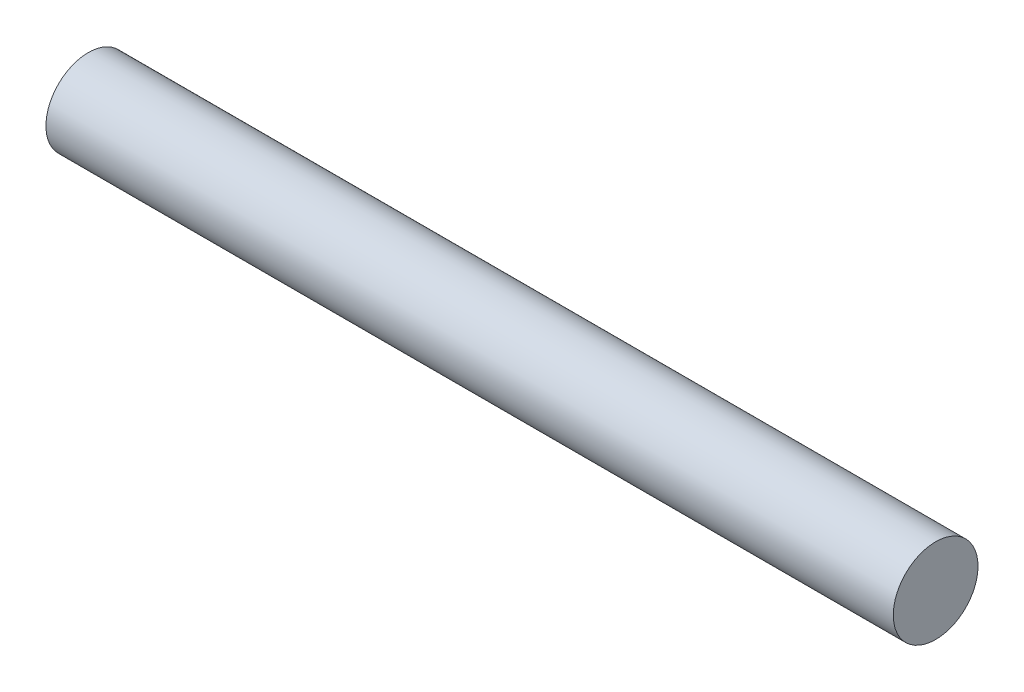
ISO-10303-21;
HEADER;
FILE_DESCRIPTION(('STEP AP214'),'2;1');
FILE_NAME('part.step','',(''),(''),'','','');
FILE_SCHEMA(('AUTOMOTIVE_DESIGN { 1 0 10303 214 1 1 1 1 }'));
ENDSEC;
DATA;
#1=APPLICATION_CONTEXT('core data for automotive mechanical design processes');
#2=APPLICATION_PROTOCOL_DEFINITION('international standard','automotive_design',2000,#1);
#3=PRODUCT_CONTEXT('',#1,'mechanical');
#4=PRODUCT('Part','Part','',(#3));
#5=PRODUCT_RELATED_PRODUCT_CATEGORY('part','',(#4));
#6=PRODUCT_DEFINITION_FORMATION('','',#4);
#7=PRODUCT_DEFINITION_CONTEXT('part definition',#1,'design');
#8=PRODUCT_DEFINITION('design','',#6,#7);
#9=PRODUCT_DEFINITION_SHAPE('','',#8);
#10=(LENGTH_UNIT() NAMED_UNIT(*) SI_UNIT(.MILLI.,.METRE.));
#11=(NAMED_UNIT(*) PLANE_ANGLE_UNIT() SI_UNIT($,.RADIAN.));
#12=(NAMED_UNIT(*) SI_UNIT($,.STERADIAN.) SOLID_ANGLE_UNIT());
#13=UNCERTAINTY_MEASURE_WITH_UNIT(LENGTH_MEASURE(1.E-05),#10,'distance_accuracy_value','');
#14=(GEOMETRIC_REPRESENTATION_CONTEXT(3) GLOBAL_UNCERTAINTY_ASSIGNED_CONTEXT((#13)) GLOBAL_UNIT_ASSIGNED_CONTEXT((#10,
#11,#12)) REPRESENTATION_CONTEXT('',''));
#15=CARTESIAN_POINT('',(0.,0.,0.));
#16=DIRECTION('',(0.,0.,1.));
#17=DIRECTION('',(1.,0.,0.));
#18=AXIS2_PLACEMENT_3D('',#15,#16,#17);
#19=CARTESIAN_POINT('',(63.5,0.,0.));
#20=DIRECTION('',(-1.,0.,0.));
#21=DIRECTION('',(0.,0.,1.));
#22=AXIS2_PLACEMENT_3D('',#19,#20,#21);
#23=CYLINDRICAL_SURFACE('',#22,3.175);
#24=CARTESIAN_POINT('',(63.5,0.,0.));
#25=DIRECTION('',(1.,0.,0.));
#26=DIRECTION('',(0.,0.,-1.));
#27=AXIS2_PLACEMENT_3D('',#24,#25,#26);
#28=CIRCLE('',#27,3.175);
#29=CARTESIAN_POINT('',(63.5,0.,-3.175));
#30=VERTEX_POINT('',#29);
#31=EDGE_CURVE('E10',#30,#30,#28,.T.);
#32=ORIENTED_EDGE('',*,*,#31,.F.);
#33=EDGE_LOOP('',(#32));
#34=FACE_BOUND('',#33,.T.);
#35=CARTESIAN_POINT('',(0.,0.,0.));
#36=DIRECTION('',(1.,0.,0.));
#37=DIRECTION('',(0.,0.,-1.));
#38=AXIS2_PLACEMENT_3D('',#35,#36,#37);
#39=CIRCLE('',#38,3.175);
#40=CARTESIAN_POINT('',(0.,0.,-3.175));
#41=VERTEX_POINT('',#40);
#42=EDGE_CURVE('E46',#41,#41,#39,.T.);
#43=ORIENTED_EDGE('',*,*,#42,.T.);
#44=EDGE_LOOP('',(#43));
#45=FACE_BOUND('',#44,.T.);
#46=ADVANCED_FACE('F43',(#34,#45),#23,.T.);
#47=CARTESIAN_POINT('',(63.5,0.,0.));
#48=DIRECTION('',(1.,0.,0.));
#49=DIRECTION('',(0.,0.,-1.));
#50=AXIS2_PLACEMENT_3D('',#47,#48,#49);
#51=PLANE('',#50);
#52=ORIENTED_EDGE('',*,*,#31,.T.);
#53=EDGE_LOOP('',(#52));
#54=FACE_BOUND('',#53,.T.);
#55=ADVANCED_FACE('F58',(#54),#51,.T.);
#56=CARTESIAN_POINT('',(0.,0.,0.));
#57=DIRECTION('',(1.,0.,0.));
#58=DIRECTION('',(0.,0.,-1.));
#59=AXIS2_PLACEMENT_3D('',#56,#57,#58);
#60=PLANE('',#59);
#61=ORIENTED_EDGE('',*,*,#42,.F.);
#62=EDGE_LOOP('',(#61));
#63=FACE_BOUND('',#62,.T.);
#64=ADVANCED_FACE('F56',(#63),#60,.F.);
#65=CLOSED_SHELL('',(#46,#55,#64));
#66=MANIFOLD_SOLID_BREP('B2',#65);
#67=ADVANCED_BREP_SHAPE_REPRESENTATION('',(#18,#66),#14);
#68=SHAPE_DEFINITION_REPRESENTATION(#9,#67);
ENDSEC;
END-ISO-10303-21;
